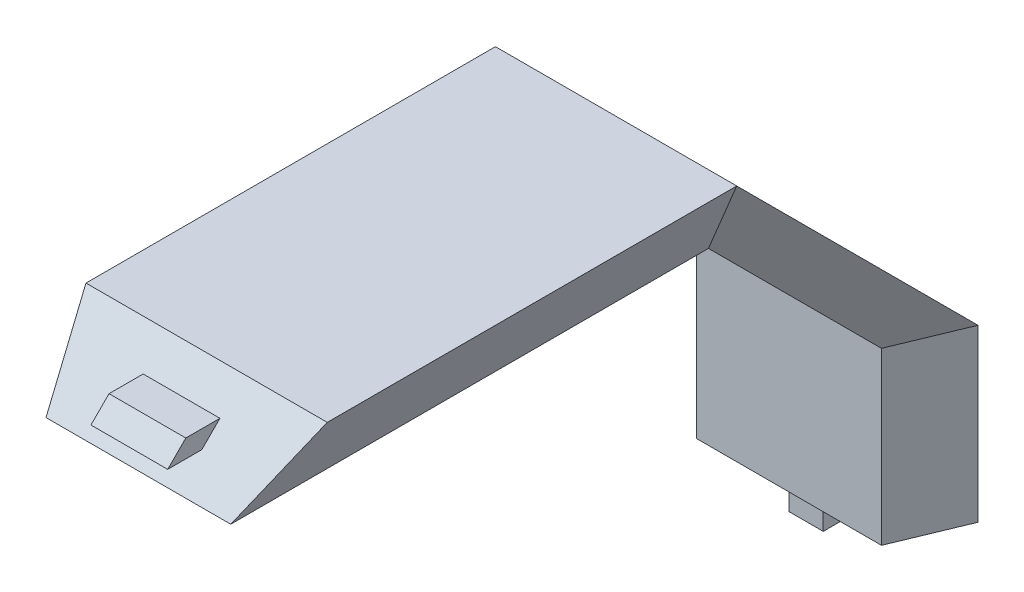
ISO-10303-21;
HEADER;
FILE_DESCRIPTION(('STEP AP214'),'2;1');
FILE_NAME('part.step','',(''),(''),'','','');
FILE_SCHEMA(('AUTOMOTIVE_DESIGN { 1 0 10303 214 1 1 1 1 }'));
ENDSEC;
DATA;
#1=APPLICATION_CONTEXT('core data for automotive mechanical design processes');
#2=APPLICATION_PROTOCOL_DEFINITION('international standard','automotive_design',2000,#1);
#3=PRODUCT_CONTEXT('',#1,'mechanical');
#4=PRODUCT('Part','Part','',(#3));
#5=PRODUCT_RELATED_PRODUCT_CATEGORY('part','',(#4));
#6=PRODUCT_DEFINITION_FORMATION('','',#4);
#7=PRODUCT_DEFINITION_CONTEXT('part definition',#1,'design');
#8=PRODUCT_DEFINITION('design','',#6,#7);
#9=PRODUCT_DEFINITION_SHAPE('','',#8);
#10=(LENGTH_UNIT() NAMED_UNIT(*) SI_UNIT(.MILLI.,.METRE.));
#11=(NAMED_UNIT(*) PLANE_ANGLE_UNIT() SI_UNIT($,.RADIAN.));
#12=(NAMED_UNIT(*) SI_UNIT($,.STERADIAN.) SOLID_ANGLE_UNIT());
#13=UNCERTAINTY_MEASURE_WITH_UNIT(LENGTH_MEASURE(1.E-05),#10,'distance_accuracy_value','');
#14=(GEOMETRIC_REPRESENTATION_CONTEXT(3) GLOBAL_UNCERTAINTY_ASSIGNED_CONTEXT((#13)) GLOBAL_UNIT_ASSIGNED_CONTEXT((#10,
#11,#12)) REPRESENTATION_CONTEXT('',''));
#15=CARTESIAN_POINT('',(0.,0.,0.));
#16=DIRECTION('',(0.,0.,1.));
#17=DIRECTION('',(1.,0.,0.));
#18=AXIS2_PLACEMENT_3D('',#15,#16,#17);
#19=CARTESIAN_POINT('',(0.,0.,0.));
#20=DIRECTION('',(0.,1.,0.));
#21=DIRECTION('',(0.,0.,1.));
#22=AXIS2_PLACEMENT_3D('',#19,#20,#21);
#23=PLANE('',#22);
#24=DIRECTION('',(-1.,0.,0.));
#25=VECTOR('',#24,1.);
#26=CARTESIAN_POINT('',(44.2100469395181,0.,-5.90062655070414));
#27=LINE('',#26,#25);
#28=CARTESIAN_POINT('',(44.2100469395181,0.,-5.90062655070414));
#29=VERTEX_POINT('',#28);
#30=CARTESIAN_POINT('',(30.0679113157872,0.,-5.90062655070413));
#31=VERTEX_POINT('',#30);
#32=EDGE_CURVE('E294',#29,#31,#27,.T.);
#33=ORIENTED_EDGE('',*,*,#32,.F.);
#34=DIRECTION('',(0.382683432365088,0.,-0.923879532511288));
#35=VECTOR('',#34,1.);
#36=CARTESIAN_POINT('',(42.5531926900257,0.,-1.90062655070414));
#37=LINE('',#36,#35);
#38=CARTESIAN_POINT('',(42.5531926900257,0.,-1.90062655070414));
#39=VERTEX_POINT('',#38);
#40=EDGE_CURVE('E300',#39,#29,#37,.T.);
#41=ORIENTED_EDGE('',*,*,#40,.F.);
#42=DIRECTION('',(1.,0.,0.));
#43=VECTOR('',#42,1.);
#44=CARTESIAN_POINT('',(31.7247655652796,0.,-1.90062655070412));
#45=LINE('',#44,#43);
#46=CARTESIAN_POINT('',(31.7247655652796,0.,-1.90062655070412));
#47=VERTEX_POINT('',#46);
#48=EDGE_CURVE('E319',#47,#39,#45,.T.);
#49=ORIENTED_EDGE('',*,*,#48,.F.);
#50=DIRECTION('',(0.382683432365092,0.,0.923879532511286));
#51=VECTOR('',#50,1.);
#52=CARTESIAN_POINT('',(30.0679113157872,0.,-5.90062655070413));
#53=LINE('',#52,#51);
#54=EDGE_CURVE('E316',#31,#47,#53,.T.);
#55=ORIENTED_EDGE('',*,*,#54,.F.);
#56=EDGE_LOOP('',(#33,#41,#49,#55));
#57=FACE_BOUND('',#56,.T.);
#58=DIRECTION('',(0.,0.,1.));
#59=VECTOR('',#58,1.);
#60=CARTESIAN_POINT('',(38.1389791276527,0.,-2.90062655070414));
#61=LINE('',#60,#59);
#62=CARTESIAN_POINT('',(38.1389791276527,0.,-4.90062655070414));
#63=VERTEX_POINT('',#62);
#64=CARTESIAN_POINT('',(38.1389791276527,0.,-2.90062655070414));
#65=VERTEX_POINT('',#64);
#66=EDGE_CURVE('E183',#63,#65,#61,.T.);
#67=ORIENTED_EDGE('',*,*,#66,.F.);
#68=DIRECTION('',(1.,0.,0.));
#69=VECTOR('',#68,1.);
#70=CARTESIAN_POINT('',(36.1389791276527,0.,-4.90062655070414));
#71=LINE('',#70,#69);
#72=CARTESIAN_POINT('',(36.1389791276527,0.,-4.90062655070414));
#73=VERTEX_POINT('',#72);
#74=EDGE_CURVE('E180',#73,#63,#71,.T.);
#75=ORIENTED_EDGE('',*,*,#74,.F.);
#76=DIRECTION('',(0.,0.,-1.));
#77=VECTOR('',#76,1.);
#78=CARTESIAN_POINT('',(36.1389791276527,0.,-2.90062655070414));
#79=LINE('',#78,#77);
#80=CARTESIAN_POINT('',(36.1389791276527,0.,-2.90062655070414));
#81=VERTEX_POINT('',#80);
#82=EDGE_CURVE('E68',#81,#73,#79,.T.);
#83=ORIENTED_EDGE('',*,*,#82,.F.);
#84=DIRECTION('',(-1.,0.,0.));
#85=VECTOR('',#84,1.);
#86=CARTESIAN_POINT('',(36.1389791276527,0.,-2.90062655070414));
#87=LINE('',#86,#85);
#88=EDGE_CURVE('E63',#65,#81,#87,.T.);
#89=ORIENTED_EDGE('',*,*,#88,.F.);
#90=EDGE_LOOP('',(#67,#75,#83,#89));
#91=FACE_BOUND('',#90,.T.);
#92=ADVANCED_FACE('F47',(#57,#91),#23,.F.);
#93=CARTESIAN_POINT('',(30.0679113157872,20.1421356237309,36.2415090730267));
#94=DIRECTION('',(0.,-0.707106781186543,-0.707106781186552));
#95=DIRECTION('',(0.,0.707106781186552,-0.707106781186543));
#96=AXIS2_PLACEMENT_3D('',#93,#94,#95);
#97=PLANE('',#96);
#98=DIRECTION('',(1.,0.,0.));
#99=VECTOR('',#98,1.);
#100=CARTESIAN_POINT('',(31.7247655652796,20.1421356237309,36.2415090730267));
#101=LINE('',#100,#99);
#102=CARTESIAN_POINT('',(31.7247655652796,20.1421356237309,36.2415090730267));
#103=VERTEX_POINT('',#102);
#104=CARTESIAN_POINT('',(42.5531926900257,20.1421356237309,36.2415090730267));
#105=VERTEX_POINT('',#104);
#106=EDGE_CURVE('E248',#103,#105,#101,.T.);
#107=ORIENTED_EDGE('',*,*,#106,.T.);
#108=DIRECTION('',(-0.281084637714821,-0.678598344545851,0.678598344545843));
#109=VECTOR('',#108,1.);
#110=CARTESIAN_POINT('',(42.5531926900257,20.1421356237309,36.2415090730267));
#111=LINE('',#110,#109);
#112=CARTESIAN_POINT('',(44.2100469395181,24.1421356237309,32.2415090730268));
#113=VERTEX_POINT('',#112);
#114=EDGE_CURVE('E240',#113,#105,#111,.T.);
#115=ORIENTED_EDGE('',*,*,#114,.F.);
#116=DIRECTION('',(1.,0.,0.));
#117=VECTOR('',#116,1.);
#118=CARTESIAN_POINT('',(30.0679113157872,24.1421356237309,32.2415090730268));
#119=LINE('',#118,#117);
#120=CARTESIAN_POINT('',(30.0679113157872,24.1421356237309,32.2415090730268));
#121=VERTEX_POINT('',#120);
#122=EDGE_CURVE('E236',#121,#113,#119,.T.);
#123=ORIENTED_EDGE('',*,*,#122,.F.);
#124=DIRECTION('',(-0.281084637714827,0.67859834454585,-0.678598344545842));
#125=VECTOR('',#124,1.);
#126=CARTESIAN_POINT('',(30.8308855951094,22.3001527708495,34.0834919259081));
#127=LINE('',#126,#125);
#128=EDGE_CURVE('E244',#103,#121,#127,.T.);
#129=ORIENTED_EDGE('',*,*,#128,.F.);
#130=EDGE_LOOP('',(#107,#115,#123,#129));
#131=FACE_BOUND('',#130,.T.);
#132=DIRECTION('',(0.,0.707106781186551,-0.707106781186544));
#133=VECTOR('',#132,1.);
#134=CARTESIAN_POINT('',(39.3889791276526,22.6724657096208,33.7111789871368));
#135=LINE('',#134,#133);
#136=CARTESIAN_POINT('',(39.3889791276526,21.611805537841,34.7718391589166));
#137=VERTEX_POINT('',#136);
#138=CARTESIAN_POINT('',(39.3889791276526,22.6724657096208,33.7111789871368));
#139=VERTEX_POINT('',#138);
#140=EDGE_CURVE('E185',#137,#139,#135,.T.);
#141=ORIENTED_EDGE('',*,*,#140,.F.);
#142=DIRECTION('',(1.,0.,0.));
#143=VECTOR('',#142,1.);
#144=CARTESIAN_POINT('',(34.8889791276527,21.611805537841,34.7718391589166));
#145=LINE('',#144,#143);
#146=CARTESIAN_POINT('',(34.8889791276527,21.611805537841,34.7718391589166));
#147=VERTEX_POINT('',#146);
#148=EDGE_CURVE('E201',#147,#137,#145,.T.);
#149=ORIENTED_EDGE('',*,*,#148,.F.);
#150=DIRECTION('',(0.,-0.707106781186551,0.707106781186544));
#151=VECTOR('',#150,1.);
#152=CARTESIAN_POINT('',(34.8889791276527,22.6724657096208,33.7111789871368));
#153=LINE('',#152,#151);
#154=CARTESIAN_POINT('',(34.8889791276527,22.6724657096208,33.7111789871368));
#155=VERTEX_POINT('',#154);
#156=EDGE_CURVE('E214',#155,#147,#153,.T.);
#157=ORIENTED_EDGE('',*,*,#156,.F.);
#158=DIRECTION('',(-1.,0.,0.));
#159=VECTOR('',#158,1.);
#160=CARTESIAN_POINT('',(34.8889791276527,22.6724657096208,33.7111789871368));
#161=LINE('',#160,#159);
#162=EDGE_CURVE('E190',#139,#155,#161,.T.);
#163=ORIENTED_EDGE('',*,*,#162,.F.);
#164=EDGE_LOOP('',(#141,#149,#157,#163));
#165=FACE_BOUND('',#164,.T.);
#166=ADVANCED_FACE('F370',(#131,#165),#97,.F.);
#167=CARTESIAN_POINT('',(44.2100469395181,10.,-5.90062655070414));
#168=DIRECTION('',(0.,0.,1.));
#169=DIRECTION('',(1.,0.,0.));
#170=AXIS2_PLACEMENT_3D('',#167,#168,#169);
#171=PLANE('',#170);
#172=ORIENTED_EDGE('',*,*,#32,.T.);
#173=DIRECTION('',(0.,-1.,0.));
#174=VECTOR('',#173,1.);
#175=CARTESIAN_POINT('',(30.0679113157872,10.,-5.90062655070413));
#176=LINE('',#175,#174);
#177=CARTESIAN_POINT('',(30.0679113157872,10.,-5.90062655070413));
#178=VERTEX_POINT('',#177);
#179=EDGE_CURVE('E11',#178,#31,#176,.T.);
#180=ORIENTED_EDGE('',*,*,#179,.F.);
#181=DIRECTION('',(-1.,0.,0.));
#182=VECTOR('',#181,1.);
#183=CARTESIAN_POINT('',(44.2100469395181,10.,-5.90062655070414));
#184=LINE('',#183,#182);
#185=CARTESIAN_POINT('',(44.2100469395181,10.,-5.90062655070414));
#186=VERTEX_POINT('',#185);
#187=EDGE_CURVE('E295',#186,#178,#184,.T.);
#188=ORIENTED_EDGE('',*,*,#187,.F.);
#189=DIRECTION('',(0.,-1.,0.));
#190=VECTOR('',#189,1.);
#191=CARTESIAN_POINT('',(44.2100469395181,10.,-5.90062655070414));
#192=LINE('',#191,#190);
#193=EDGE_CURVE('E312',#186,#29,#192,.T.);
#194=ORIENTED_EDGE('',*,*,#193,.T.);
#195=EDGE_LOOP('',(#172,#180,#188,#194));
#196=FACE_BOUND('',#195,.T.);
#197=ADVANCED_FACE('F49',(#196),#171,.F.);
#198=CARTESIAN_POINT('',(30.0679113157872,10.,-5.90062655070413));
#199=DIRECTION('',(0.923879532511286,0.,-0.382683432365092));
#200=DIRECTION('',(-0.382683432365092,0.,-0.923879532511286));
#201=AXIS2_PLACEMENT_3D('',#198,#199,#200);
#202=PLANE('',#201);
#203=ORIENTED_EDGE('',*,*,#54,.T.);
#204=DIRECTION('',(0.,-1.,0.));
#205=VECTOR('',#204,1.);
#206=CARTESIAN_POINT('',(31.7247655652796,10.,-1.90062655070412));
#207=LINE('',#206,#205);
#208=CARTESIAN_POINT('',(31.7247655652796,10.,-1.90062655070412));
#209=VERTEX_POINT('',#208);
#210=EDGE_CURVE('E56',#209,#47,#207,.T.);
#211=ORIENTED_EDGE('',*,*,#210,.F.);
#212=DIRECTION('',(0.382683432365092,0.,0.923879532511286));
#213=VECTOR('',#212,1.);
#214=CARTESIAN_POINT('',(30.0679113157872,10.,-5.90062655070413));
#215=LINE('',#214,#213);
#216=EDGE_CURVE('E299',#178,#209,#215,.T.);
#217=ORIENTED_EDGE('',*,*,#216,.F.);
#218=ORIENTED_EDGE('',*,*,#179,.T.);
#219=EDGE_LOOP('',(#203,#211,#217,#218));
#220=FACE_BOUND('',#219,.T.);
#221=ADVANCED_FACE('F363',(#220),#202,.F.);
#222=CARTESIAN_POINT('',(31.7247655652796,10.,-1.90062655070412));
#223=DIRECTION('',(0.,0.,-1.));
#224=DIRECTION('',(-1.,0.,0.));
#225=AXIS2_PLACEMENT_3D('',#222,#223,#224);
#226=PLANE('',#225);
#227=ORIENTED_EDGE('',*,*,#48,.T.);
#228=DIRECTION('',(0.,-1.,0.));
#229=VECTOR('',#228,1.);
#230=CARTESIAN_POINT('',(42.5531926900257,10.,-1.90062655070414));
#231=LINE('',#230,#229);
#232=CARTESIAN_POINT('',(42.5531926900257,10.,-1.90062655070414));
#233=VERTEX_POINT('',#232);
#234=EDGE_CURVE('E327',#233,#39,#231,.T.);
#235=ORIENTED_EDGE('',*,*,#234,.F.);
#236=DIRECTION('',(1.,0.,0.));
#237=VECTOR('',#236,1.);
#238=CARTESIAN_POINT('',(31.7247655652796,10.,-1.90062655070412));
#239=LINE('',#238,#237);
#240=EDGE_CURVE('E304',#209,#233,#239,.T.);
#241=ORIENTED_EDGE('',*,*,#240,.F.);
#242=ORIENTED_EDGE('',*,*,#210,.T.);
#243=EDGE_LOOP('',(#227,#235,#241,#242));
#244=FACE_BOUND('',#243,.T.);
#245=ADVANCED_FACE('F336',(#244),#226,.F.);
#246=CARTESIAN_POINT('',(42.5531926900257,10.,-1.90062655070414));
#247=DIRECTION('',(-0.923879532511288,0.,-0.382683432365088));
#248=DIRECTION('',(-0.382683432365088,0.,0.923879532511288));
#249=AXIS2_PLACEMENT_3D('',#246,#247,#248);
#250=PLANE('',#249);
#251=ORIENTED_EDGE('',*,*,#40,.T.);
#252=ORIENTED_EDGE('',*,*,#193,.F.);
#253=DIRECTION('',(0.382683432365088,0.,-0.923879532511288));
#254=VECTOR('',#253,1.);
#255=CARTESIAN_POINT('',(42.5531926900257,10.,-1.90062655070414));
#256=LINE('',#255,#254);
#257=EDGE_CURVE('E308',#233,#186,#256,.T.);
#258=ORIENTED_EDGE('',*,*,#257,.F.);
#259=ORIENTED_EDGE('',*,*,#234,.T.);
#260=EDGE_LOOP('',(#251,#252,#258,#259));
#261=FACE_BOUND('',#260,.T.);
#262=ADVANCED_FACE('F344',(#261),#250,.F.);
#263=CARTESIAN_POINT('',(44.2100469395181,24.1421356237309,8.24150907302689));
#264=DIRECTION('',(0.,-0.707106781186551,0.707106781186544));
#265=DIRECTION('',(0.,-0.707106781186544,-0.707106781186551));
#266=AXIS2_PLACEMENT_3D('',#263,#264,#265);
#267=PLANE('',#266);
#268=ORIENTED_EDGE('',*,*,#187,.T.);
#269=DIRECTION('',(0.,-0.707106781186544,-0.707106781186551));
#270=VECTOR('',#269,1.);
#271=CARTESIAN_POINT('',(30.0679113157872,24.1421356237309,8.2415090730269));
#272=LINE('',#271,#270);
#273=CARTESIAN_POINT('',(30.0679113157872,24.1421356237309,8.24150907302691));
#274=VERTEX_POINT('',#273);
#275=EDGE_CURVE('E290',#274,#178,#272,.T.);
#276=ORIENTED_EDGE('',*,*,#275,.F.);
#277=DIRECTION('',(-1.,0.,0.));
#278=VECTOR('',#277,1.);
#279=CARTESIAN_POINT('',(44.2100469395181,24.1421356237309,8.24150907302689));
#280=LINE('',#279,#278);
#281=CARTESIAN_POINT('',(44.2100469395181,24.1421356237309,8.24150907302669));
#282=VERTEX_POINT('',#281);
#283=EDGE_CURVE('E276',#282,#274,#280,.T.);
#284=ORIENTED_EDGE('',*,*,#283,.F.);
#285=DIRECTION('',(0.,-0.707106781186544,-0.707106781186551));
#286=VECTOR('',#285,1.);
#287=CARTESIAN_POINT('',(44.2100469395181,24.1421356237309,8.24150907302689));
#288=LINE('',#287,#286);
#289=EDGE_CURVE('E280',#282,#186,#288,.T.);
#290=ORIENTED_EDGE('',*,*,#289,.T.);
#291=EDGE_LOOP('',(#268,#276,#284,#290));
#292=FACE_BOUND('',#291,.T.);
#293=ADVANCED_FACE('F350',(#292),#267,.F.);
#294=CARTESIAN_POINT('',(30.0679113157872,24.1421356237309,8.2415090730269));
#295=DIRECTION('',(0.862856209461014,0.357406744336597,-0.357406744336595));
#296=DIRECTION('',(-0.382683432365094,0.923879532511285,0.));
#297=AXIS2_PLACEMENT_3D('',#294,#295,#296);
#298=PLANE('',#297);
#299=DIRECTION('',(0.,-0.707106781186544,-0.707106781186551));
#300=VECTOR('',#299,1.);
#301=CARTESIAN_POINT('',(31.7247655652796,24.1421356237309,12.2415090730269));
#302=LINE('',#301,#300);
#303=CARTESIAN_POINT('',(31.7247655652796,20.1421356237309,8.24150907302669));
#304=VERTEX_POINT('',#303);
#305=EDGE_CURVE('E287',#304,#209,#302,.T.);
#306=ORIENTED_EDGE('',*,*,#305,.F.);
#307=DIRECTION('',(-0.38268343236509,0.923879532511287,0.));
#308=VECTOR('',#307,1.);
#309=CARTESIAN_POINT('',(30.0679113157872,24.1421356237309,8.24150907302691));
#310=LINE('',#309,#308);
#311=EDGE_CURVE('E272',#304,#274,#310,.T.);
#312=ORIENTED_EDGE('',*,*,#311,.T.);
#313=ORIENTED_EDGE('',*,*,#275,.T.);
#314=ORIENTED_EDGE('',*,*,#216,.T.);
#315=EDGE_LOOP('',(#306,#312,#313,#314));
#316=FACE_BOUND('',#315,.T.);
#317=ADVANCED_FACE('F362',(#316),#298,.F.);
#318=CARTESIAN_POINT('',(31.7247655652796,24.1421356237309,12.2415090730269));
#319=DIRECTION('',(0.,0.707106781186551,-0.707106781186544));
#320=DIRECTION('',(0.,0.707106781186544,0.707106781186551));
#321=AXIS2_PLACEMENT_3D('',#318,#319,#320);
#322=PLANE('',#321);
#323=DIRECTION('',(0.,-0.707106781186544,-0.707106781186551));
#324=VECTOR('',#323,1.);
#325=CARTESIAN_POINT('',(42.5531926900257,24.1421356237309,12.2415090730269));
#326=LINE('',#325,#324);
#327=CARTESIAN_POINT('',(42.5531926900257,20.1421356237309,8.24150907302669));
#328=VERTEX_POINT('',#327);
#329=EDGE_CURVE('E284',#328,#233,#326,.T.);
#330=ORIENTED_EDGE('',*,*,#329,.F.);
#331=DIRECTION('',(1.,0.,0.));
#332=VECTOR('',#331,1.);
#333=CARTESIAN_POINT('',(30.0679113157872,20.1421356237309,8.24150907302687));
#334=LINE('',#333,#332);
#335=EDGE_CURVE('E265',#304,#328,#334,.T.);
#336=ORIENTED_EDGE('',*,*,#335,.F.);
#337=ORIENTED_EDGE('',*,*,#305,.T.);
#338=ORIENTED_EDGE('',*,*,#240,.T.);
#339=EDGE_LOOP('',(#330,#336,#337,#338));
#340=FACE_BOUND('',#339,.T.);
#341=ADVANCED_FACE('F358',(#340),#322,.F.);
#342=CARTESIAN_POINT('',(42.5531926900257,24.1421356237309,12.2415090730269));
#343=DIRECTION('',(-0.862856209461016,0.357406744336597,-0.357406744336591));
#344=DIRECTION('',(-0.382683432365093,-0.923879532511285,0.));
#345=AXIS2_PLACEMENT_3D('',#342,#343,#344);
#346=PLANE('',#345);
#347=ORIENTED_EDGE('',*,*,#289,.F.);
#348=DIRECTION('',(-0.38268343236509,-0.923879532511287,0.));
#349=VECTOR('',#348,1.);
#350=CARTESIAN_POINT('',(43.9674062523988,23.556349186104,8.24150907302689));
#351=LINE('',#350,#349);
#352=EDGE_CURVE('E268',#282,#328,#351,.T.);
#353=ORIENTED_EDGE('',*,*,#352,.T.);
#354=ORIENTED_EDGE('',*,*,#329,.T.);
#355=ORIENTED_EDGE('',*,*,#257,.T.);
#356=EDGE_LOOP('',(#347,#353,#354,#355));
#357=FACE_BOUND('',#356,.T.);
#358=ADVANCED_FACE('F354',(#357),#346,.F.);
#359=CARTESIAN_POINT('',(44.2100469395181,24.1421356237309,36.2415090730267));
#360=DIRECTION('',(0.,-1.,0.));
#361=DIRECTION('',(1.,0.,0.));
#362=AXIS2_PLACEMENT_3D('',#359,#360,#361);
#363=PLANE('',#362);
#364=DIRECTION('',(0.,0.,-1.));
#365=VECTOR('',#364,1.);
#366=CARTESIAN_POINT('',(30.0679113157872,24.1421356237309,36.2415090730267));
#367=LINE('',#366,#365);
#368=EDGE_CURVE('E262',#121,#274,#367,.T.);
#369=ORIENTED_EDGE('',*,*,#368,.F.);
#370=ORIENTED_EDGE('',*,*,#122,.T.);
#371=DIRECTION('',(0.,0.,-1.));
#372=VECTOR('',#371,1.);
#373=CARTESIAN_POINT('',(44.2100469395181,24.1421356237309,36.2415090730267));
#374=LINE('',#373,#372);
#375=EDGE_CURVE('E251',#113,#282,#374,.T.);
#376=ORIENTED_EDGE('',*,*,#375,.T.);
#377=ORIENTED_EDGE('',*,*,#283,.T.);
#378=EDGE_LOOP('',(#369,#370,#376,#377));
#379=FACE_BOUND('',#378,.T.);
#380=ADVANCED_FACE('F397',(#379),#363,.F.);
#381=CARTESIAN_POINT('',(30.0679113157872,24.1421356237309,36.2415090730267));
#382=DIRECTION('',(0.923879532511284,0.382683432365096,0.));
#383=DIRECTION('',(-0.382683432365096,0.923879532511285,0.));
#384=AXIS2_PLACEMENT_3D('',#381,#382,#383);
#385=PLANE('',#384);
#386=DIRECTION('',(0.,0.,-1.));
#387=VECTOR('',#386,1.);
#388=CARTESIAN_POINT('',(31.7247655652796,20.1421356237309,36.2415090730267));
#389=LINE('',#388,#387);
#390=EDGE_CURVE('E258',#103,#304,#389,.T.);
#391=ORIENTED_EDGE('',*,*,#390,.F.);
#392=ORIENTED_EDGE('',*,*,#128,.T.);
#393=ORIENTED_EDGE('',*,*,#368,.T.);
#394=ORIENTED_EDGE('',*,*,#311,.F.);
#395=EDGE_LOOP('',(#391,#392,#393,#394));
#396=FACE_BOUND('',#395,.T.);
#397=ADVANCED_FACE('F400',(#396),#385,.F.);
#398=CARTESIAN_POINT('',(31.7247655652796,20.1421356237309,36.2415090730267));
#399=DIRECTION('',(0.,1.,0.));
#400=DIRECTION('',(0.,0.,1.));
#401=AXIS2_PLACEMENT_3D('',#398,#399,#400);
#402=PLANE('',#401);
#403=ORIENTED_EDGE('',*,*,#335,.T.);
#404=DIRECTION('',(0.,0.,-1.));
#405=VECTOR('',#404,1.);
#406=CARTESIAN_POINT('',(42.5531926900257,20.1421356237309,36.2415090730267));
#407=LINE('',#406,#405);
#408=EDGE_CURVE('E254',#105,#328,#407,.T.);
#409=ORIENTED_EDGE('',*,*,#408,.F.);
#410=ORIENTED_EDGE('',*,*,#106,.F.);
#411=ORIENTED_EDGE('',*,*,#390,.T.);
#412=EDGE_LOOP('',(#403,#409,#410,#411));
#413=FACE_BOUND('',#412,.T.);
#414=ADVANCED_FACE('F404',(#413),#402,.F.);
#415=CARTESIAN_POINT('',(42.5531926900257,20.1421356237309,36.2415090730267));
#416=DIRECTION('',(-0.923879532511287,0.382683432365089,0.));
#417=DIRECTION('',(-0.382683432365089,-0.923879532511287,0.));
#418=AXIS2_PLACEMENT_3D('',#415,#416,#417);
#419=PLANE('',#418);
#420=ORIENTED_EDGE('',*,*,#375,.F.);
#421=ORIENTED_EDGE('',*,*,#114,.T.);
#422=ORIENTED_EDGE('',*,*,#408,.T.);
#423=ORIENTED_EDGE('',*,*,#352,.F.);
#424=EDGE_LOOP('',(#420,#421,#422,#423));
#425=FACE_BOUND('',#424,.T.);
#426=ADVANCED_FACE('F408',(#425),#419,.F.);
#427=CARTESIAN_POINT('',(39.3889791276526,22.6724657096208,35.7111789871368));
#428=DIRECTION('',(-1.,0.,0.));
#429=DIRECTION('',(0.,0.,1.));
#430=AXIS2_PLACEMENT_3D('',#427,#428,#429);
#431=PLANE('',#430);
#432=ORIENTED_EDGE('',*,*,#140,.T.);
#433=DIRECTION('',(0.,0.,-1.));
#434=VECTOR('',#433,1.);
#435=CARTESIAN_POINT('',(39.3889791276526,22.6724657096208,35.7111789871368));
#436=LINE('',#435,#434);
#437=CARTESIAN_POINT('',(39.3889791276526,22.6724657096208,35.7111789871368));
#438=VERTEX_POINT('',#437);
#439=EDGE_CURVE('E232',#438,#139,#436,.T.);
#440=ORIENTED_EDGE('',*,*,#439,.F.);
#441=DIRECTION('',(0.,0.707106781186551,-0.707106781186544));
#442=VECTOR('',#441,1.);
#443=CARTESIAN_POINT('',(39.3889791276526,22.6724657096208,35.7111789871368));
#444=LINE('',#443,#442);
#445=CARTESIAN_POINT('',(39.3889791276526,21.611805537841,36.7718391589166));
#446=VERTEX_POINT('',#445);
#447=EDGE_CURVE('E196',#446,#438,#444,.T.);
#448=ORIENTED_EDGE('',*,*,#447,.F.);
#449=DIRECTION('',(0.,0.,-1.));
#450=VECTOR('',#449,1.);
#451=CARTESIAN_POINT('',(39.3889791276526,21.611805537841,36.7718391589166));
#452=LINE('',#451,#450);
#453=EDGE_CURVE('E209',#446,#137,#452,.T.);
#454=ORIENTED_EDGE('',*,*,#453,.T.);
#455=EDGE_LOOP('',(#432,#440,#448,#454));
#456=FACE_BOUND('',#455,.T.);
#457=ADVANCED_FACE('F411',(#456),#431,.F.);
#458=CARTESIAN_POINT('',(34.8889791276527,22.6724657096208,35.7111789871368));
#459=DIRECTION('',(0.,-1.,0.));
#460=DIRECTION('',(0.,0.,-1.));
#461=AXIS2_PLACEMENT_3D('',#458,#459,#460);
#462=PLANE('',#461);
#463=ORIENTED_EDGE('',*,*,#162,.T.);
#464=DIRECTION('',(0.,0.,-1.));
#465=VECTOR('',#464,1.);
#466=CARTESIAN_POINT('',(34.8889791276527,22.6724657096208,35.7111789871368));
#467=LINE('',#466,#465);
#468=CARTESIAN_POINT('',(34.8889791276527,22.6724657096208,35.7111789871368));
#469=VERTEX_POINT('',#468);
#470=EDGE_CURVE('E228',#469,#155,#467,.T.);
#471=ORIENTED_EDGE('',*,*,#470,.F.);
#472=DIRECTION('',(-1.,0.,0.));
#473=VECTOR('',#472,1.);
#474=CARTESIAN_POINT('',(34.8889791276527,22.6724657096208,35.7111789871368));
#475=LINE('',#474,#473);
#476=EDGE_CURVE('E200',#438,#469,#475,.T.);
#477=ORIENTED_EDGE('',*,*,#476,.F.);
#478=ORIENTED_EDGE('',*,*,#439,.T.);
#479=EDGE_LOOP('',(#463,#471,#477,#478));
#480=FACE_BOUND('',#479,.T.);
#481=ADVANCED_FACE('F416',(#480),#462,.F.);
#482=CARTESIAN_POINT('',(34.8889791276527,22.6724657096208,35.7111789871368));
#483=DIRECTION('',(1.,0.,0.));
#484=DIRECTION('',(0.,0.,-1.));
#485=AXIS2_PLACEMENT_3D('',#482,#483,#484);
#486=PLANE('',#485);
#487=ORIENTED_EDGE('',*,*,#156,.T.);
#488=DIRECTION('',(0.,0.,-1.));
#489=VECTOR('',#488,1.);
#490=CARTESIAN_POINT('',(34.8889791276527,21.611805537841,36.7718391589166));
#491=LINE('',#490,#489);
#492=CARTESIAN_POINT('',(34.8889791276527,21.611805537841,36.7718391589166));
#493=VERTEX_POINT('',#492);
#494=EDGE_CURVE('E224',#493,#147,#491,.T.);
#495=ORIENTED_EDGE('',*,*,#494,.F.);
#496=DIRECTION('',(0.,-0.707106781186551,0.707106781186544));
#497=VECTOR('',#496,1.);
#498=CARTESIAN_POINT('',(34.8889791276527,22.6724657096208,35.7111789871368));
#499=LINE('',#498,#497);
#500=EDGE_CURVE('E204',#469,#493,#499,.T.);
#501=ORIENTED_EDGE('',*,*,#500,.F.);
#502=ORIENTED_EDGE('',*,*,#470,.T.);
#503=EDGE_LOOP('',(#487,#495,#501,#502));
#504=FACE_BOUND('',#503,.T.);
#505=ADVANCED_FACE('F420',(#504),#486,.F.);
#506=CARTESIAN_POINT('',(34.8889791276527,21.611805537841,36.7718391589166));
#507=DIRECTION('',(0.,1.,0.));
#508=DIRECTION('',(0.,0.,1.));
#509=AXIS2_PLACEMENT_3D('',#506,#507,#508);
#510=PLANE('',#509);
#511=ORIENTED_EDGE('',*,*,#148,.T.);
#512=ORIENTED_EDGE('',*,*,#453,.F.);
#513=DIRECTION('',(1.,0.,0.));
#514=VECTOR('',#513,1.);
#515=CARTESIAN_POINT('',(34.8889791276527,21.611805537841,36.7718391589166));
#516=LINE('',#515,#514);
#517=EDGE_CURVE('E207',#493,#446,#516,.T.);
#518=ORIENTED_EDGE('',*,*,#517,.F.);
#519=ORIENTED_EDGE('',*,*,#494,.T.);
#520=EDGE_LOOP('',(#511,#512,#518,#519));
#521=FACE_BOUND('',#520,.T.);
#522=ADVANCED_FACE('F424',(#521),#510,.F.);
#523=CARTESIAN_POINT('',(0.,28.1918223483787,30.191822348379));
#524=DIRECTION('',(0.,0.707106781186544,0.707106781186551));
#525=DIRECTION('',(0.,-0.707106781186551,0.707106781186544));
#526=AXIS2_PLACEMENT_3D('',#523,#524,#525);
#527=PLANE('',#526);
#528=ORIENTED_EDGE('',*,*,#447,.T.);
#529=ORIENTED_EDGE('',*,*,#476,.T.);
#530=ORIENTED_EDGE('',*,*,#500,.T.);
#531=ORIENTED_EDGE('',*,*,#517,.T.);
#532=EDGE_LOOP('',(#528,#529,#530,#531));
#533=FACE_BOUND('',#532,.T.);
#534=ADVANCED_FACE('F428',(#533),#527,.T.);
#535=CARTESIAN_POINT('',(38.1389791276527,-2.,-2.90062655070414));
#536=DIRECTION('',(-1.,0.,0.));
#537=DIRECTION('',(0.,0.,1.));
#538=AXIS2_PLACEMENT_3D('',#535,#536,#537);
#539=PLANE('',#538);
#540=ORIENTED_EDGE('',*,*,#66,.T.);
#541=DIRECTION('',(0.,1.,0.));
#542=VECTOR('',#541,1.);
#543=CARTESIAN_POINT('',(38.1389791276527,-2.,-2.90062655070414));
#544=LINE('',#543,#542);
#545=CARTESIAN_POINT('',(38.1389791276527,-2.,-2.90062655070414));
#546=VERTEX_POINT('',#545);
#547=EDGE_CURVE('E162',#546,#65,#544,.T.);
#548=ORIENTED_EDGE('',*,*,#547,.F.);
#549=DIRECTION('',(0.,0.,1.));
#550=VECTOR('',#549,1.);
#551=CARTESIAN_POINT('',(38.1389791276527,-2.,-2.90062655070414));
#552=LINE('',#551,#550);
#553=CARTESIAN_POINT('',(38.1389791276527,-2.,-4.90062655070414));
#554=VERTEX_POINT('',#553);
#555=EDGE_CURVE('E170',#554,#546,#552,.T.);
#556=ORIENTED_EDGE('',*,*,#555,.F.);
#557=DIRECTION('',(0.,1.,0.));
#558=VECTOR('',#557,1.);
#559=CARTESIAN_POINT('',(38.1389791276527,-2.,-4.90062655070414));
#560=LINE('',#559,#558);
#561=EDGE_CURVE('E676',#554,#63,#560,.T.);
#562=ORIENTED_EDGE('',*,*,#561,.T.);
#563=EDGE_LOOP('',(#540,#548,#556,#562));
#564=FACE_BOUND('',#563,.T.);
#565=ADVANCED_FACE('F182',(#564),#539,.F.);
#566=CARTESIAN_POINT('',(36.1389791276527,-2.,-2.90062655070414));
#567=DIRECTION('',(0.,0.,-1.));
#568=DIRECTION('',(-1.,0.,0.));
#569=AXIS2_PLACEMENT_3D('',#566,#567,#568);
#570=PLANE('',#569);
#571=ORIENTED_EDGE('',*,*,#88,.T.);
#572=DIRECTION('',(0.,1.,0.));
#573=VECTOR('',#572,1.);
#574=CARTESIAN_POINT('',(36.1389791276527,-2.,-2.90062655070414));
#575=LINE('',#574,#573);
#576=CARTESIAN_POINT('',(36.1389791276527,-2.,-2.90062655070414));
#577=VERTEX_POINT('',#576);
#578=EDGE_CURVE('E165',#577,#81,#575,.T.);
#579=ORIENTED_EDGE('',*,*,#578,.F.);
#580=DIRECTION('',(-1.,0.,0.));
#581=VECTOR('',#580,1.);
#582=CARTESIAN_POINT('',(36.1389791276527,-2.,-2.90062655070414));
#583=LINE('',#582,#581);
#584=EDGE_CURVE('E158',#546,#577,#583,.T.);
#585=ORIENTED_EDGE('',*,*,#584,.F.);
#586=ORIENTED_EDGE('',*,*,#547,.T.);
#587=EDGE_LOOP('',(#571,#579,#585,#586));
#588=FACE_BOUND('',#587,.T.);
#589=ADVANCED_FACE('F160',(#588),#570,.F.);
#590=CARTESIAN_POINT('',(36.1389791276527,-2.,-2.90062655070414));
#591=DIRECTION('',(1.,0.,0.));
#592=DIRECTION('',(0.,0.,-1.));
#593=AXIS2_PLACEMENT_3D('',#590,#591,#592);
#594=PLANE('',#593);
#595=ORIENTED_EDGE('',*,*,#82,.T.);
#596=DIRECTION('',(0.,1.,0.));
#597=VECTOR('',#596,1.);
#598=CARTESIAN_POINT('',(36.1389791276527,-2.,-4.90062655070414));
#599=LINE('',#598,#597);
#600=CARTESIAN_POINT('',(36.1389791276527,-2.,-4.90062655070414));
#601=VERTEX_POINT('',#600);
#602=EDGE_CURVE('E192',#601,#73,#599,.T.);
#603=ORIENTED_EDGE('',*,*,#602,.F.);
#604=DIRECTION('',(0.,0.,-1.));
#605=VECTOR('',#604,1.);
#606=CARTESIAN_POINT('',(36.1389791276527,-2.,-2.90062655070414));
#607=LINE('',#606,#605);
#608=EDGE_CURVE('E169',#577,#601,#607,.T.);
#609=ORIENTED_EDGE('',*,*,#608,.F.);
#610=ORIENTED_EDGE('',*,*,#578,.T.);
#611=EDGE_LOOP('',(#595,#603,#609,#610));
#612=FACE_BOUND('',#611,.T.);
#613=ADVANCED_FACE('F437',(#612),#594,.F.);
#614=CARTESIAN_POINT('',(36.1389791276527,-2.,-4.90062655070414));
#615=DIRECTION('',(0.,0.,1.));
#616=DIRECTION('',(1.,0.,0.));
#617=AXIS2_PLACEMENT_3D('',#614,#615,#616);
#618=PLANE('',#617);
#619=ORIENTED_EDGE('',*,*,#74,.T.);
#620=ORIENTED_EDGE('',*,*,#561,.F.);
#621=DIRECTION('',(1.,0.,0.));
#622=VECTOR('',#621,1.);
#623=CARTESIAN_POINT('',(36.1389791276527,-2.,-4.90062655070414));
#624=LINE('',#623,#622);
#625=EDGE_CURVE('E175',#601,#554,#624,.T.);
#626=ORIENTED_EDGE('',*,*,#625,.F.);
#627=ORIENTED_EDGE('',*,*,#602,.T.);
#628=EDGE_LOOP('',(#619,#620,#626,#627));
#629=FACE_BOUND('',#628,.T.);
#630=ADVANCED_FACE('F440',(#629),#618,.F.);
#631=CARTESIAN_POINT('',(0.,-2.,0.));
#632=DIRECTION('',(0.,-1.,0.));
#633=DIRECTION('',(0.,0.,-1.));
#634=AXIS2_PLACEMENT_3D('',#631,#632,#633);
#635=PLANE('',#634);
#636=ORIENTED_EDGE('',*,*,#555,.T.);
#637=ORIENTED_EDGE('',*,*,#584,.T.);
#638=ORIENTED_EDGE('',*,*,#608,.T.);
#639=ORIENTED_EDGE('',*,*,#625,.T.);
#640=EDGE_LOOP('',(#636,#637,#638,#639));
#641=FACE_BOUND('',#640,.T.);
#642=ADVANCED_FACE('F173',(#641),#635,.T.);
#643=CLOSED_SHELL('',(#92,#166,#197,#221,#245,#262,#293,#317,#341,#358,#380,#397,#414,#426,#457,
#481,#505,#522,#534,#565,#589,#613,#630,#642));
#644=MANIFOLD_SOLID_BREP('B2',#643);
#645=ADVANCED_BREP_SHAPE_REPRESENTATION('',(#18,#644),#14);
#646=SHAPE_DEFINITION_REPRESENTATION(#9,#645);
ENDSEC;
END-ISO-10303-21;
